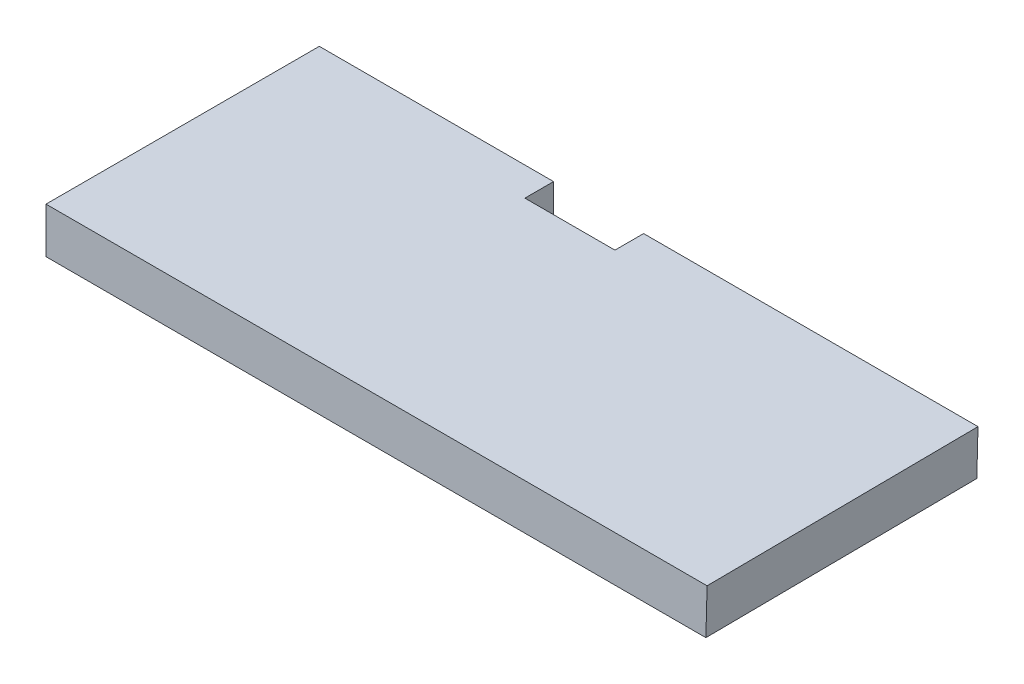
ISO-10303-21;
HEADER;
FILE_DESCRIPTION(('STEP AP214'),'2;1');
FILE_NAME('part.step','',(''),(''),'','','');
FILE_SCHEMA(('AUTOMOTIVE_DESIGN { 1 0 10303 214 1 1 1 1 }'));
ENDSEC;
DATA;
#1=APPLICATION_CONTEXT('core data for automotive mechanical design processes');
#2=APPLICATION_PROTOCOL_DEFINITION('international standard','automotive_design',2000,#1);
#3=PRODUCT_CONTEXT('',#1,'mechanical');
#4=PRODUCT('Part','Part','',(#3));
#5=PRODUCT_RELATED_PRODUCT_CATEGORY('part','',(#4));
#6=PRODUCT_DEFINITION_FORMATION('','',#4);
#7=PRODUCT_DEFINITION_CONTEXT('part definition',#1,'design');
#8=PRODUCT_DEFINITION('design','',#6,#7);
#9=PRODUCT_DEFINITION_SHAPE('','',#8);
#10=(LENGTH_UNIT() NAMED_UNIT(*) SI_UNIT(.MILLI.,.METRE.));
#11=(NAMED_UNIT(*) PLANE_ANGLE_UNIT() SI_UNIT($,.RADIAN.));
#12=(NAMED_UNIT(*) SI_UNIT($,.STERADIAN.) SOLID_ANGLE_UNIT());
#13=UNCERTAINTY_MEASURE_WITH_UNIT(LENGTH_MEASURE(1.E-05),#10,'distance_accuracy_value','');
#14=(GEOMETRIC_REPRESENTATION_CONTEXT(3) GLOBAL_UNCERTAINTY_ASSIGNED_CONTEXT((#13)) GLOBAL_UNIT_ASSIGNED_CONTEXT((#10,
#11,#12)) REPRESENTATION_CONTEXT('',''));
#15=CARTESIAN_POINT('',(0.,0.,0.));
#16=DIRECTION('',(0.,0.,1.));
#17=DIRECTION('',(1.,0.,0.));
#18=AXIS2_PLACEMENT_3D('',#15,#16,#17);
#19=CARTESIAN_POINT('',(109.518729734506,-2.8679580702388,-0.955755475004912));
#20=DIRECTION('',(-0.999619261087744,0.0261769483078608,0.00872354513260905));
#21=DIRECTION('',(-0.0261779444007335,-0.999657298891451,0.));
#22=AXIS2_PLACEMENT_3D('',#19,#20,#21);
#23=PLANE('',#22);
#24=DIRECTION('',(-0.0261779444007335,-0.999657298891451,0.));
#25=VECTOR('',#24,1.);
#26=CARTESIAN_POINT('',(104.958916425134,-202.705955403487,76.2));
#27=LINE('',#26,#25);
#28=CARTESIAN_POINT('',(104.945978919458,-203.2,76.2));
#29=VERTEX_POINT('',#28);
#30=CARTESIAN_POINT('',(104.613405052136,-215.9,76.2));
#31=VERTEX_POINT('',#30);
#32=EDGE_CURVE('E11',#29,#31,#27,.T.);
#33=ORIENTED_EDGE('',*,*,#32,.T.);
#34=DIRECTION('',(0.00872653549837426,0.,0.999961923064171));
#35=VECTOR('',#34,1.);
#36=CARTESIAN_POINT('',(104.599393889507,-215.9,74.5944797876412));
#37=LINE('',#36,#35);
#38=CARTESIAN_POINT('',(103.94841772648,-215.9,0.));
#39=VERTEX_POINT('',#38);
#40=EDGE_CURVE('E41',#39,#31,#37,.T.);
#41=ORIENTED_EDGE('',*,*,#40,.F.);
#42=DIRECTION('',(-0.0261779444007335,-0.999657298891451,0.));
#43=VECTOR('',#42,1.);
#44=CARTESIAN_POINT('',(104.294384805167,-202.68855336799,0.));
#45=LINE('',#44,#43);
#46=CARTESIAN_POINT('',(104.280991593802,-203.2,0.));
#47=VERTEX_POINT('',#46);
#48=EDGE_CURVE('E159',#47,#39,#45,.T.);
#49=ORIENTED_EDGE('',*,*,#48,.F.);
#50=DIRECTION('',(-0.00872653549837426,0.,-0.999961923064171));
#51=VECTOR('',#50,1.);
#52=CARTESIAN_POINT('',(104.931942430524,-203.2,74.5915776804898));
#53=LINE('',#52,#51);
#54=EDGE_CURVE('E53',#29,#47,#53,.T.);
#55=ORIENTED_EDGE('',*,*,#54,.F.);
#56=EDGE_LOOP('',(#33,#41,#49,#55));
#57=FACE_BOUND('',#56,.T.);
#58=ADVANCED_FACE('F34',(#57),#23,.F.);
#59=CARTESIAN_POINT('',(0.,0.,8.));
#60=DIRECTION('',(0.,0.,-1.));
#61=DIRECTION('',(-1.,0.,0.));
#62=AXIS2_PLACEMENT_3D('',#59,#60,#61);
#63=PLANE('',#62);
#64=DIRECTION('',(1.,0.,0.));
#65=VECTOR('',#64,1.);
#66=CARTESIAN_POINT('',(-79.375,-203.2,7.99999999999999));
#67=LINE('',#66,#65);
#68=CARTESIAN_POINT('',(-14.0585299874686,-203.2,8.));
#69=VERTEX_POINT('',#68);
#70=CARTESIAN_POINT('',(11.0517288416866,-203.2,8.));
#71=VERTEX_POINT('',#70);
#72=EDGE_CURVE('E104',#69,#71,#67,.T.);
#73=ORIENTED_EDGE('',*,*,#72,.T.);
#74=DIRECTION('',(0.,-1.,0.));
#75=VECTOR('',#74,1.);
#76=CARTESIAN_POINT('',(11.0517288416866,-215.789162496268,8.));
#77=LINE('',#76,#75);
#78=CARTESIAN_POINT('',(11.0517288416866,-215.789162496268,8.));
#79=VERTEX_POINT('',#78);
#80=EDGE_CURVE('E97',#71,#79,#77,.T.);
#81=ORIENTED_EDGE('',*,*,#80,.T.);
#82=DIRECTION('',(-1.,0.,0.));
#83=VECTOR('',#82,1.);
#84=CARTESIAN_POINT('',(-14.0585299874686,-215.789162496268,8.));
#85=LINE('',#84,#83);
#86=CARTESIAN_POINT('',(-14.0585299874686,-215.789162496268,8.));
#87=VERTEX_POINT('',#86);
#88=EDGE_CURVE('E102',#79,#87,#85,.T.);
#89=ORIENTED_EDGE('',*,*,#88,.T.);
#90=DIRECTION('',(0.,1.,0.));
#91=VECTOR('',#90,1.);
#92=CARTESIAN_POINT('',(-14.0585299874686,-215.789162496268,8.));
#93=LINE('',#92,#91);
#94=EDGE_CURVE('E108',#87,#69,#93,.T.);
#95=ORIENTED_EDGE('',*,*,#94,.T.);
#96=EDGE_LOOP('',(#73,#81,#89,#95));
#97=FACE_BOUND('',#96,.T.);
#98=ADVANCED_FACE('F99',(#97),#63,.T.);
#99=CARTESIAN_POINT('',(11.0517288416866,-215.789162496268,8.));
#100=DIRECTION('',(1.,0.,0.));
#101=DIRECTION('',(0.,0.,-1.));
#102=AXIS2_PLACEMENT_3D('',#99,#100,#101);
#103=PLANE('',#102);
#104=DIRECTION('',(0.,1.,0.));
#105=VECTOR('',#104,1.);
#106=CARTESIAN_POINT('',(11.0517288416866,-203.2,0.));
#107=LINE('',#106,#105);
#108=CARTESIAN_POINT('',(11.0517288416866,-215.789162496268,0.));
#109=VERTEX_POINT('',#108);
#110=CARTESIAN_POINT('',(11.0517288416866,-203.2,0.));
#111=VERTEX_POINT('',#110);
#112=EDGE_CURVE('E114',#109,#111,#107,.T.);
#113=ORIENTED_EDGE('',*,*,#112,.F.);
#114=DIRECTION('',(0.,0.,-1.));
#115=VECTOR('',#114,1.);
#116=CARTESIAN_POINT('',(11.0517288416866,-215.789162496268,8.));
#117=LINE('',#116,#115);
#118=EDGE_CURVE('E111',#79,#109,#117,.T.);
#119=ORIENTED_EDGE('',*,*,#118,.F.);
#120=ORIENTED_EDGE('',*,*,#80,.F.);
#121=DIRECTION('',(0.,0.,1.));
#122=VECTOR('',#121,1.);
#123=CARTESIAN_POINT('',(11.0517288416866,-203.2,76.2));
#124=LINE('',#123,#122);
#125=EDGE_CURVE('E129',#111,#71,#124,.T.);
#126=ORIENTED_EDGE('',*,*,#125,.F.);
#127=EDGE_LOOP('',(#113,#119,#120,#126));
#128=FACE_BOUND('',#127,.T.);
#129=ADVANCED_FACE('F112',(#128),#103,.F.);
#130=CARTESIAN_POINT('',(-14.0585299874686,-215.789162496268,8.));
#131=DIRECTION('',(0.,-1.,0.));
#132=DIRECTION('',(0.,0.,-1.));
#133=AXIS2_PLACEMENT_3D('',#130,#131,#132);
#134=PLANE('',#133);
#135=DIRECTION('',(-1.,0.,0.));
#136=VECTOR('',#135,1.);
#137=CARTESIAN_POINT('',(-14.0585299874686,-215.789162496268,0.));
#138=LINE('',#137,#136);
#139=CARTESIAN_POINT('',(-14.0585299874686,-215.789162496268,0.));
#140=VERTEX_POINT('',#139);
#141=EDGE_CURVE('E127',#109,#140,#138,.T.);
#142=ORIENTED_EDGE('',*,*,#141,.T.);
#143=DIRECTION('',(0.,0.,-1.));
#144=VECTOR('',#143,1.);
#145=CARTESIAN_POINT('',(-14.0585299874686,-215.789162496268,8.));
#146=LINE('',#145,#144);
#147=EDGE_CURVE('E118',#87,#140,#146,.T.);
#148=ORIENTED_EDGE('',*,*,#147,.F.);
#149=ORIENTED_EDGE('',*,*,#88,.F.);
#150=ORIENTED_EDGE('',*,*,#118,.T.);
#151=EDGE_LOOP('',(#142,#148,#149,#150));
#152=FACE_BOUND('',#151,.T.);
#153=ADVANCED_FACE('F120',(#152),#134,.F.);
#154=CARTESIAN_POINT('',(-14.0585299874686,-215.789162496268,8.));
#155=DIRECTION('',(-1.,0.,0.));
#156=DIRECTION('',(0.,0.,1.));
#157=AXIS2_PLACEMENT_3D('',#154,#155,#156);
#158=PLANE('',#157);
#159=ORIENTED_EDGE('',*,*,#94,.F.);
#160=ORIENTED_EDGE('',*,*,#147,.T.);
#161=DIRECTION('',(0.,1.,0.));
#162=VECTOR('',#161,1.);
#163=CARTESIAN_POINT('',(-14.0585299874686,-215.789162496268,0.));
#164=LINE('',#163,#162);
#165=CARTESIAN_POINT('',(-14.0585299874686,-203.2,0.));
#166=VERTEX_POINT('',#165);
#167=EDGE_CURVE('E125',#140,#166,#164,.T.);
#168=ORIENTED_EDGE('',*,*,#167,.T.);
#169=DIRECTION('',(0.,0.,-1.));
#170=VECTOR('',#169,1.);
#171=CARTESIAN_POINT('',(-14.0585299874686,-203.2,76.2));
#172=LINE('',#171,#170);
#173=EDGE_CURVE('E132',#69,#166,#172,.T.);
#174=ORIENTED_EDGE('',*,*,#173,.F.);
#175=EDGE_LOOP('',(#159,#160,#168,#174));
#176=FACE_BOUND('',#175,.T.);
#177=ADVANCED_FACE('F172',(#176),#158,.F.);
#178=CARTESIAN_POINT('',(-79.375,-203.2,76.2));
#179=DIRECTION('',(1.,0.,0.));
#180=DIRECTION('',(0.,1.,0.));
#181=AXIS2_PLACEMENT_3D('',#178,#179,#180);
#182=PLANE('',#181);
#183=DIRECTION('',(0.,-1.,0.));
#184=VECTOR('',#183,1.);
#185=CARTESIAN_POINT('',(-79.375,-203.2,0.));
#186=LINE('',#185,#184);
#187=CARTESIAN_POINT('',(-79.375,-203.2,0.));
#188=VERTEX_POINT('',#187);
#189=CARTESIAN_POINT('',(-79.375,-215.9,0.));
#190=VERTEX_POINT('',#189);
#191=EDGE_CURVE('E135',#188,#190,#186,.T.);
#192=ORIENTED_EDGE('',*,*,#191,.T.);
#193=DIRECTION('',(0.,0.,-1.));
#194=VECTOR('',#193,1.);
#195=CARTESIAN_POINT('',(-79.375,-215.9,76.2));
#196=LINE('',#195,#194);
#197=CARTESIAN_POINT('',(-79.375,-215.9,76.2));
#198=VERTEX_POINT('',#197);
#199=EDGE_CURVE('E154',#198,#190,#196,.T.);
#200=ORIENTED_EDGE('',*,*,#199,.F.);
#201=DIRECTION('',(0.,-1.,0.));
#202=VECTOR('',#201,1.);
#203=CARTESIAN_POINT('',(-79.375,-203.2,76.2));
#204=LINE('',#203,#202);
#205=CARTESIAN_POINT('',(-79.375,-203.2,76.2));
#206=VERTEX_POINT('',#205);
#207=EDGE_CURVE('E136',#206,#198,#204,.T.);
#208=ORIENTED_EDGE('',*,*,#207,.F.);
#209=DIRECTION('',(0.,0.,-1.));
#210=VECTOR('',#209,1.);
#211=CARTESIAN_POINT('',(-79.375,-203.2,76.2));
#212=LINE('',#211,#210);
#213=EDGE_CURVE('E145',#206,#188,#212,.T.);
#214=ORIENTED_EDGE('',*,*,#213,.T.);
#215=EDGE_LOOP('',(#192,#200,#208,#214));
#216=FACE_BOUND('',#215,.T.);
#217=ADVANCED_FACE('F175',(#216),#182,.F.);
#218=CARTESIAN_POINT('',(-79.375,-215.9,76.2));
#219=DIRECTION('',(0.,1.,0.));
#220=DIRECTION('',(-1.,0.,0.));
#221=AXIS2_PLACEMENT_3D('',#218,#219,#220);
#222=PLANE('',#221);
#223=DIRECTION('',(1.,0.,0.));
#224=VECTOR('',#223,1.);
#225=CARTESIAN_POINT('',(-79.375,-215.9,0.));
#226=LINE('',#225,#224);
#227=EDGE_CURVE('E148',#190,#39,#226,.T.);
#228=ORIENTED_EDGE('',*,*,#227,.T.);
#229=ORIENTED_EDGE('',*,*,#40,.T.);
#230=DIRECTION('',(1.,0.,0.));
#231=VECTOR('',#230,1.);
#232=CARTESIAN_POINT('',(-79.375,-215.9,76.2));
#233=LINE('',#232,#231);
#234=EDGE_CURVE('E139',#198,#31,#233,.T.);
#235=ORIENTED_EDGE('',*,*,#234,.F.);
#236=ORIENTED_EDGE('',*,*,#199,.T.);
#237=EDGE_LOOP('',(#228,#229,#235,#236));
#238=FACE_BOUND('',#237,.T.);
#239=ADVANCED_FACE('F177',(#238),#222,.F.);
#240=CARTESIAN_POINT('',(-79.375,-203.2,76.2));
#241=DIRECTION('',(0.,-1.,0.));
#242=DIRECTION('',(0.,0.,-1.));
#243=AXIS2_PLACEMENT_3D('',#240,#241,#242);
#244=PLANE('',#243);
#245=DIRECTION('',(-1.,0.,0.));
#246=VECTOR('',#245,1.);
#247=CARTESIAN_POINT('',(-79.375,-203.2,76.2));
#248=LINE('',#247,#246);
#249=EDGE_CURVE('E143',#29,#206,#248,.T.);
#250=ORIENTED_EDGE('',*,*,#249,.F.);
#251=ORIENTED_EDGE('',*,*,#54,.T.);
#252=DIRECTION('',(-1.,0.,0.));
#253=VECTOR('',#252,1.);
#254=CARTESIAN_POINT('',(-79.375,-203.2,0.));
#255=LINE('',#254,#253);
#256=EDGE_CURVE('E140',#47,#111,#255,.T.);
#257=ORIENTED_EDGE('',*,*,#256,.T.);
#258=ORIENTED_EDGE('',*,*,#125,.T.);
#259=ORIENTED_EDGE('',*,*,#72,.F.);
#260=ORIENTED_EDGE('',*,*,#173,.T.);
#261=EDGE_CURVE('E150',#166,#188,#255,.T.);
#262=ORIENTED_EDGE('',*,*,#261,.T.);
#263=ORIENTED_EDGE('',*,*,#213,.F.);
#264=EDGE_LOOP('',(#250,#251,#257,#258,#259,#260,#262,#263));
#265=FACE_BOUND('',#264,.T.);
#266=ADVANCED_FACE('F163',(#265),#244,.F.);
#267=CARTESIAN_POINT('',(123.825,-203.2,0.));
#268=DIRECTION('',(0.,0.,1.));
#269=DIRECTION('',(1.,0.,0.));
#270=AXIS2_PLACEMENT_3D('',#267,#268,#269);
#271=PLANE('',#270);
#272=ORIENTED_EDGE('',*,*,#256,.F.);
#273=ORIENTED_EDGE('',*,*,#48,.T.);
#274=ORIENTED_EDGE('',*,*,#227,.F.);
#275=ORIENTED_EDGE('',*,*,#191,.F.);
#276=ORIENTED_EDGE('',*,*,#261,.F.);
#277=ORIENTED_EDGE('',*,*,#167,.F.);
#278=ORIENTED_EDGE('',*,*,#141,.F.);
#279=ORIENTED_EDGE('',*,*,#112,.T.);
#280=EDGE_LOOP('',(#272,#273,#274,#275,#276,#277,#278,#279));
#281=FACE_BOUND('',#280,.T.);
#282=ADVANCED_FACE('F167',(#281),#271,.F.);
#283=CARTESIAN_POINT('',(123.825,-203.2,76.2));
#284=DIRECTION('',(0.,0.,1.));
#285=DIRECTION('',(1.,0.,0.));
#286=AXIS2_PLACEMENT_3D('',#283,#284,#285);
#287=PLANE('',#286);
#288=ORIENTED_EDGE('',*,*,#32,.F.);
#289=ORIENTED_EDGE('',*,*,#249,.T.);
#290=ORIENTED_EDGE('',*,*,#207,.T.);
#291=ORIENTED_EDGE('',*,*,#234,.T.);
#292=EDGE_LOOP('',(#288,#289,#290,#291));
#293=FACE_BOUND('',#292,.T.);
#294=ADVANCED_FACE('F179',(#293),#287,.T.);
#295=CLOSED_SHELL('',(#58,#98,#129,#153,#177,#217,#239,#266,#282,#294));
#296=MANIFOLD_SOLID_BREP('B2',#295);
#297=ADVANCED_BREP_SHAPE_REPRESENTATION('',(#18,#296),#14);
#298=SHAPE_DEFINITION_REPRESENTATION(#9,#297);
ENDSEC;
END-ISO-10303-21;
